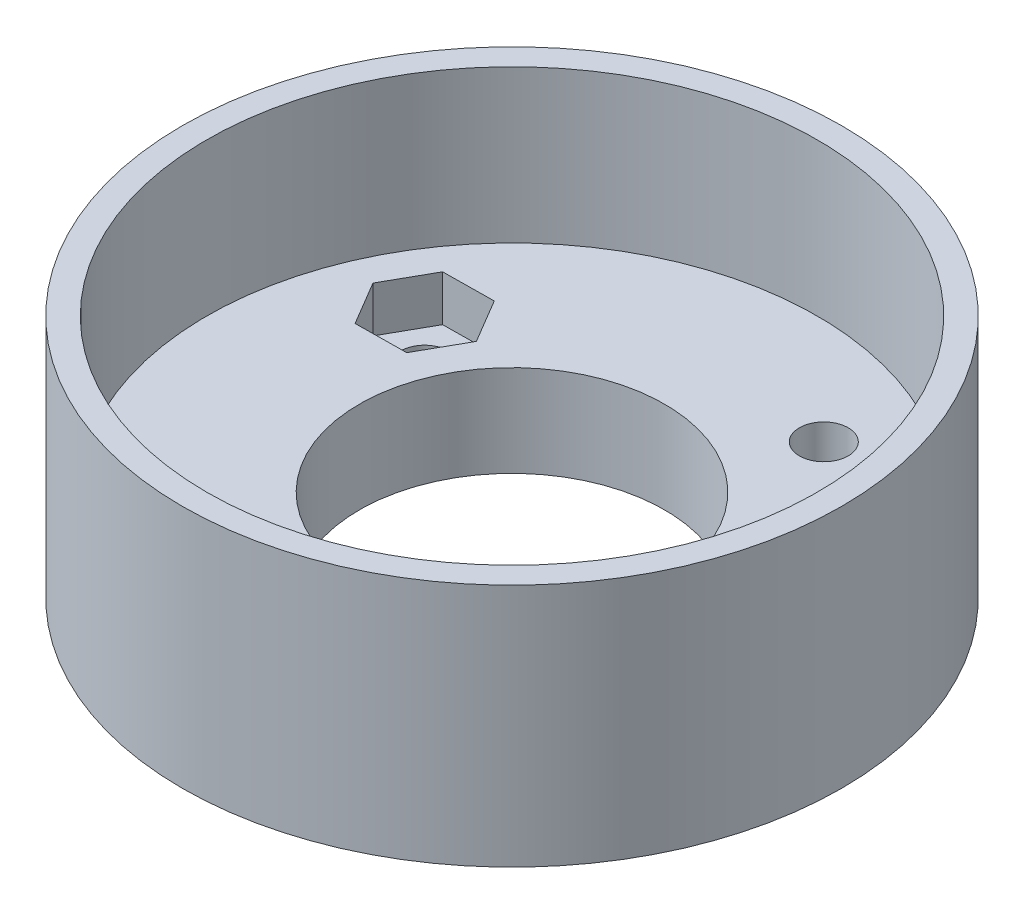
ISO-10303-21;
HEADER;
FILE_DESCRIPTION(('STEP AP214'),'2;1');
FILE_NAME('part.step','',(''),(''),'','','');
FILE_SCHEMA(('AUTOMOTIVE_DESIGN { 1 0 10303 214 1 1 1 1 }'));
ENDSEC;
DATA;
#1=APPLICATION_CONTEXT('core data for automotive mechanical design processes');
#2=APPLICATION_PROTOCOL_DEFINITION('international standard','automotive_design',2000,#1);
#3=PRODUCT_CONTEXT('',#1,'mechanical');
#4=PRODUCT('Part','Part','',(#3));
#5=PRODUCT_RELATED_PRODUCT_CATEGORY('part','',(#4));
#6=PRODUCT_DEFINITION_FORMATION('','',#4);
#7=PRODUCT_DEFINITION_CONTEXT('part definition',#1,'design');
#8=PRODUCT_DEFINITION('design','',#6,#7);
#9=PRODUCT_DEFINITION_SHAPE('','',#8);
#10=(LENGTH_UNIT() NAMED_UNIT(*) SI_UNIT(.MILLI.,.METRE.));
#11=(NAMED_UNIT(*) PLANE_ANGLE_UNIT() SI_UNIT($,.RADIAN.));
#12=(NAMED_UNIT(*) SI_UNIT($,.STERADIAN.) SOLID_ANGLE_UNIT());
#13=UNCERTAINTY_MEASURE_WITH_UNIT(LENGTH_MEASURE(1.E-05),#10,'distance_accuracy_value','');
#14=(GEOMETRIC_REPRESENTATION_CONTEXT(3) GLOBAL_UNCERTAINTY_ASSIGNED_CONTEXT((#13)) GLOBAL_UNIT_ASSIGNED_CONTEXT((#10,
#11,#12)) REPRESENTATION_CONTEXT('',''));
#15=CARTESIAN_POINT('',(0.,0.,0.));
#16=DIRECTION('',(0.,0.,1.));
#17=DIRECTION('',(1.,0.,0.));
#18=AXIS2_PLACEMENT_3D('',#15,#16,#17);
#19=CARTESIAN_POINT('',(-13.0741103754361,-6.,-7.35306996368954));
#20=DIRECTION('',(0.,1.,0.));
#21=DIRECTION('',(0.,0.,1.));
#22=AXIS2_PLACEMENT_3D('',#19,#20,#21);
#23=CYLINDRICAL_SURFACE('',#22,1.6);
#24=CARTESIAN_POINT('',(-13.0741103754361,-6.,-7.35306996368954));
#25=DIRECTION('',(0.,1.,0.));
#26=DIRECTION('',(0.,0.,-1.));
#27=AXIS2_PLACEMENT_3D('',#24,#25,#26);
#28=CIRCLE('',#27,1.6);
#29=CARTESIAN_POINT('',(-13.0741103754361,-6.,-8.95306996368954));
#30=VERTEX_POINT('',#29);
#31=EDGE_CURVE('E246',#30,#30,#28,.T.);
#32=ORIENTED_EDGE('',*,*,#31,.F.);
#33=EDGE_LOOP('',(#32));
#34=FACE_BOUND('',#33,.T.);
#35=CARTESIAN_POINT('',(-13.0741103754361,-3.,-7.35306996368954));
#36=DIRECTION('',(0.,1.,0.));
#37=DIRECTION('',(0.,0.,-1.));
#38=AXIS2_PLACEMENT_3D('',#35,#36,#37);
#39=CIRCLE('',#38,1.6);
#40=CARTESIAN_POINT('',(-13.0741103754361,-3.,-8.95306996368954));
#41=VERTEX_POINT('',#40);
#42=EDGE_CURVE('E217',#41,#41,#39,.T.);
#43=ORIENTED_EDGE('',*,*,#42,.T.);
#44=EDGE_LOOP('',(#43));
#45=FACE_BOUND('',#44,.T.);
#46=ADVANCED_FACE('F34',(#34,#45),#23,.F.);
#47=CARTESIAN_POINT('',(13.0741103754361,-6.,7.35306996368954));
#48=DIRECTION('',(0.,1.,0.));
#49=DIRECTION('',(0.,0.,1.));
#50=AXIS2_PLACEMENT_3D('',#47,#48,#49);
#51=CYLINDRICAL_SURFACE('',#50,1.6);
#52=CARTESIAN_POINT('',(13.0741103754361,-6.,7.35306996368954));
#53=DIRECTION('',(0.,1.,0.));
#54=DIRECTION('',(0.,0.,1.));
#55=AXIS2_PLACEMENT_3D('',#52,#53,#54);
#56=CIRCLE('',#55,1.6);
#57=CARTESIAN_POINT('',(13.0741103754361,-6.,8.95306996368954));
#58=VERTEX_POINT('',#57);
#59=EDGE_CURVE('E296',#58,#58,#56,.T.);
#60=ORIENTED_EDGE('',*,*,#59,.F.);
#61=EDGE_LOOP('',(#60));
#62=FACE_BOUND('',#61,.T.);
#63=CARTESIAN_POINT('',(13.0741103754361,-3.,7.35306996368954));
#64=DIRECTION('',(0.,1.,0.));
#65=DIRECTION('',(0.,0.,1.));
#66=AXIS2_PLACEMENT_3D('',#63,#64,#65);
#67=CIRCLE('',#66,1.6);
#68=CARTESIAN_POINT('',(13.0741103754361,-3.,8.95306996368954));
#69=VERTEX_POINT('',#68);
#70=EDGE_CURVE('E256',#69,#69,#67,.T.);
#71=ORIENTED_EDGE('',*,*,#70,.T.);
#72=EDGE_LOOP('',(#71));
#73=FACE_BOUND('',#72,.T.);
#74=ADVANCED_FACE('F436',(#62,#73),#51,.F.);
#75=CARTESIAN_POINT('',(0.,-6.,0.));
#76=DIRECTION('',(0.,1.,0.));
#77=DIRECTION('',(0.,0.,1.));
#78=AXIS2_PLACEMENT_3D('',#75,#76,#77);
#79=PLANE('',#78);
#80=ORIENTED_EDGE('',*,*,#31,.T.);
#81=EDGE_LOOP('',(#80));
#82=FACE_BOUND('',#81,.T.);
#83=ORIENTED_EDGE('',*,*,#59,.T.);
#84=EDGE_LOOP('',(#83));
#85=FACE_BOUND('',#84,.T.);
#86=DIRECTION('',(0.860333371471835,0.,-0.509731782344309));
#87=VECTOR('',#86,1.);
#88=CARTESIAN_POINT('',(-2.34476619878382,-6.,-3.95753350877044));
#89=LINE('',#88,#87);
#90=CARTESIAN_POINT('',(7.390822392013,-6.,-9.72569163108992));
#91=VERTEX_POINT('',#90);
#92=CARTESIAN_POINT('',(10.2717618729631,-6.,-11.4325955652457));
#93=VERTEX_POINT('',#92);
#94=EDGE_CURVE('E362',#91,#93,#89,.T.);
#95=ORIENTED_EDGE('',*,*,#94,.T.);
#96=DIRECTION('',(-0.0112739868905746,0.,-0.999936446590278));
#97=VECTOR('',#96,1.);
#98=CARTESIAN_POINT('',(10.3993390445389,-6.,-0.117249463661976));
#99=LINE('',#98,#97);
#100=CARTESIAN_POINT('',(10.2340094446396,-6.,-14.7810143095919));
#101=VERTEX_POINT('',#100);
#102=EDGE_CURVE('E380',#93,#101,#99,.T.);
#103=ORIENTED_EDGE('',*,*,#102,.T.);
#104=DIRECTION('',(-0.871607358362409,0.,-0.490204664245969));
#105=VECTOR('',#104,1.);
#106=CARTESIAN_POINT('',(8.77466349000284,-6.,-15.6017717146871));
#107=LINE('',#106,#105);
#108=CARTESIAN_POINT('',(7.31531753536608,-6.,-16.4225291197823));
#109=VERTEX_POINT('',#108);
#110=EDGE_CURVE('E383',#101,#109,#107,.T.);
#111=ORIENTED_EDGE('',*,*,#110,.T.);
#112=DIRECTION('',(-0.860333371471835,0.,0.509731782344308));
#113=VECTOR('',#112,1.);
#114=CARTESIAN_POINT('',(-5.30121053638081,-6.,-8.94746706330709));
#115=LINE('',#114,#113);
#116=CARTESIAN_POINT('',(4.434378054416,-6.,-14.7156251856266));
#117=VERTEX_POINT('',#116);
#118=EDGE_CURVE('E386',#109,#117,#115,.T.);
#119=ORIENTED_EDGE('',*,*,#118,.T.);
#120=DIRECTION('',(0.0112739868905743,0.,0.999936446590278));
#121=VECTOR('',#120,1.);
#122=CARTESIAN_POINT('',(4.59970765431528,-6.,-0.0518603396966419));
#123=LINE('',#122,#121);
#124=CARTESIAN_POINT('',(4.47213048273946,-6.,-11.3672064412804));
#125=VERTEX_POINT('',#124);
#126=EDGE_CURVE('E389',#117,#125,#123,.T.);
#127=ORIENTED_EDGE('',*,*,#126,.T.);
#128=DIRECTION('',(0.871607358362409,0.,0.490204664245969));
#129=VECTOR('',#128,1.);
#130=CARTESIAN_POINT('',(5.93147643737622,-6.,-10.5464490361851));
#131=LINE('',#130,#129);
#132=EDGE_CURVE('E367',#125,#91,#131,.T.);
#133=ORIENTED_EDGE('',*,*,#132,.T.);
#134=EDGE_LOOP('',(#95,#103,#111,#119,#127,#133));
#135=FACE_BOUND('',#134,.T.);
#136=CARTESIAN_POINT('',(0.,-6.,0.));
#137=DIRECTION('',(0.,1.,0.));
#138=DIRECTION('',(0.,0.,1.));
#139=AXIS2_PLACEMENT_3D('',#136,#137,#138);
#140=CIRCLE('',#139,21.6);
#141=CARTESIAN_POINT('',(0.,-6.,21.6));
#142=VERTEX_POINT('',#141);
#143=EDGE_CURVE('E411',#142,#142,#140,.T.);
#144=ORIENTED_EDGE('',*,*,#143,.F.);
#145=EDGE_LOOP('',(#144));
#146=FACE_BOUND('',#145,.T.);
#147=CARTESIAN_POINT('',(0.,-6.,0.));
#148=DIRECTION('',(0.,1.,0.));
#149=DIRECTION('',(0.,0.,1.));
#150=AXIS2_PLACEMENT_3D('',#147,#148,#149);
#151=CIRCLE('',#150,10.);
#152=CARTESIAN_POINT('',(0.,-6.,10.));
#153=VERTEX_POINT('',#152);
#154=EDGE_CURVE('E414',#153,#153,#151,.T.);
#155=ORIENTED_EDGE('',*,*,#154,.T.);
#156=EDGE_LOOP('',(#155));
#157=FACE_BOUND('',#156,.T.);
#158=DIRECTION('',(-0.860333371471835,0.,0.509731782344309));
#159=VECTOR('',#158,1.);
#160=CARTESIAN_POINT('',(2.34476619878382,-6.,3.95753350877044));
#161=LINE('',#160,#159);
#162=CARTESIAN_POINT('',(-7.390822392013,-6.,9.72569163108992));
#163=VERTEX_POINT('',#162);
#164=CARTESIAN_POINT('',(-10.2717618729631,-6.,11.4325955652457));
#165=VERTEX_POINT('',#164);
#166=EDGE_CURVE('E311',#163,#165,#161,.T.);
#167=ORIENTED_EDGE('',*,*,#166,.T.);
#168=DIRECTION('',(0.0112739868905746,0.,0.999936446590278));
#169=VECTOR('',#168,1.);
#170=CARTESIAN_POINT('',(-10.3993390445389,-6.,0.117249463661976));
#171=LINE('',#170,#169);
#172=CARTESIAN_POINT('',(-10.2340094446396,-6.,14.7810143095919));
#173=VERTEX_POINT('',#172);
#174=EDGE_CURVE('E329',#165,#173,#171,.T.);
#175=ORIENTED_EDGE('',*,*,#174,.T.);
#176=DIRECTION('',(0.871607358362409,0.,0.490204664245969));
#177=VECTOR('',#176,1.);
#178=CARTESIAN_POINT('',(-8.77466349000284,-6.,15.6017717146871));
#179=LINE('',#178,#177);
#180=CARTESIAN_POINT('',(-7.31531753536608,-6.,16.4225291197823));
#181=VERTEX_POINT('',#180);
#182=EDGE_CURVE('E332',#173,#181,#179,.T.);
#183=ORIENTED_EDGE('',*,*,#182,.T.);
#184=DIRECTION('',(0.860333371471835,0.,-0.509731782344308));
#185=VECTOR('',#184,1.);
#186=CARTESIAN_POINT('',(5.30121053638081,-6.,8.94746706330709));
#187=LINE('',#186,#185);
#188=CARTESIAN_POINT('',(-4.434378054416,-6.,14.7156251856266));
#189=VERTEX_POINT('',#188);
#190=EDGE_CURVE('E335',#181,#189,#187,.T.);
#191=ORIENTED_EDGE('',*,*,#190,.T.);
#192=DIRECTION('',(-0.0112739868905743,0.,-0.999936446590278));
#193=VECTOR('',#192,1.);
#194=CARTESIAN_POINT('',(-4.59970765431528,-6.,0.0518603396966419));
#195=LINE('',#194,#193);
#196=CARTESIAN_POINT('',(-4.47213048273946,-6.,11.3672064412804));
#197=VERTEX_POINT('',#196);
#198=EDGE_CURVE('E338',#189,#197,#195,.T.);
#199=ORIENTED_EDGE('',*,*,#198,.T.);
#200=DIRECTION('',(-0.871607358362409,0.,-0.490204664245969));
#201=VECTOR('',#200,1.);
#202=CARTESIAN_POINT('',(-5.93147643737622,-6.,10.5464490361851));
#203=LINE('',#202,#201);
#204=EDGE_CURVE('E316',#197,#163,#203,.T.);
#205=ORIENTED_EDGE('',*,*,#204,.T.);
#206=EDGE_LOOP('',(#167,#175,#183,#191,#199,#205));
#207=FACE_BOUND('',#206,.T.);
#208=ADVANCED_FACE('F429',(#82,#85,#135,#146,#157,#207),#79,.F.);
#209=CARTESIAN_POINT('',(0.,10.,0.));
#210=DIRECTION('',(0.,-1.,0.));
#211=DIRECTION('',(0.,0.,-1.));
#212=AXIS2_PLACEMENT_3D('',#209,#210,#211);
#213=CYLINDRICAL_SURFACE('',#212,20.);
#214=CARTESIAN_POINT('',(0.,10.,0.));
#215=DIRECTION('',(0.,1.,0.));
#216=DIRECTION('',(0.,0.,1.));
#217=AXIS2_PLACEMENT_3D('',#214,#215,#216);
#218=CIRCLE('',#217,20.);
#219=CARTESIAN_POINT('',(0.,10.,20.));
#220=VERTEX_POINT('',#219);
#221=EDGE_CURVE('E43',#220,#220,#218,.T.);
#222=ORIENTED_EDGE('',*,*,#221,.T.);
#223=EDGE_LOOP('',(#222));
#224=FACE_BOUND('',#223,.T.);
#225=CARTESIAN_POINT('',(0.,0.,0.));
#226=DIRECTION('',(0.,1.,0.));
#227=DIRECTION('',(0.,0.,1.));
#228=AXIS2_PLACEMENT_3D('',#225,#226,#227);
#229=CIRCLE('',#228,20.);
#230=CARTESIAN_POINT('',(0.,0.,20.));
#231=VERTEX_POINT('',#230);
#232=EDGE_CURVE('E38',#231,#231,#229,.T.);
#233=ORIENTED_EDGE('',*,*,#232,.F.);
#234=EDGE_LOOP('',(#233));
#235=FACE_BOUND('',#234,.T.);
#236=ADVANCED_FACE('F36',(#224,#235),#213,.F.);
#237=CARTESIAN_POINT('',(0.,10.,0.));
#238=DIRECTION('',(0.,-1.,0.));
#239=DIRECTION('',(0.,0.,-1.));
#240=AXIS2_PLACEMENT_3D('',#237,#238,#239);
#241=CYLINDRICAL_SURFACE('',#240,21.6);
#242=CARTESIAN_POINT('',(0.,10.,0.));
#243=DIRECTION('',(0.,1.,0.));
#244=DIRECTION('',(0.,0.,1.));
#245=AXIS2_PLACEMENT_3D('',#242,#243,#244);
#246=CIRCLE('',#245,21.6);
#247=CARTESIAN_POINT('',(0.,10.,21.6));
#248=VERTEX_POINT('',#247);
#249=EDGE_CURVE('E11',#248,#248,#246,.T.);
#250=ORIENTED_EDGE('',*,*,#249,.F.);
#251=EDGE_LOOP('',(#250));
#252=FACE_BOUND('',#251,.T.);
#253=ORIENTED_EDGE('',*,*,#143,.T.);
#254=EDGE_LOOP('',(#253));
#255=FACE_BOUND('',#254,.T.);
#256=ADVANCED_FACE('F428',(#252,#255),#241,.T.);
#257=CARTESIAN_POINT('',(0.,10.,0.));
#258=DIRECTION('',(0.,1.,0.));
#259=DIRECTION('',(0.,0.,1.));
#260=AXIS2_PLACEMENT_3D('',#257,#258,#259);
#261=PLANE('',#260);
#262=ORIENTED_EDGE('',*,*,#221,.F.);
#263=EDGE_LOOP('',(#262));
#264=FACE_BOUND('',#263,.T.);
#265=ORIENTED_EDGE('',*,*,#249,.T.);
#266=EDGE_LOOP('',(#265));
#267=FACE_BOUND('',#266,.T.);
#268=ADVANCED_FACE('F434',(#264,#267),#261,.T.);
#269=CARTESIAN_POINT('',(0.,0.,0.));
#270=DIRECTION('',(0.,1.,0.));
#271=DIRECTION('',(0.,0.,1.));
#272=AXIS2_PLACEMENT_3D('',#269,#270,#271);
#273=PLANE('',#272);
#274=DIRECTION('',(0.999936446590278,0.,-0.0112739868905736));
#275=VECTOR('',#274,1.);
#276=CARTESIAN_POINT('',(-0.0518603396966383,0.,-4.59970765431527));
#277=LINE('',#276,#275);
#278=CARTESIAN_POINT('',(-14.7156251856266,0.,-4.434378054416));
#279=VERTEX_POINT('',#278);
#280=CARTESIAN_POINT('',(-11.3672064412804,0.,-4.47213048273946));
#281=VERTEX_POINT('',#280);
#282=EDGE_CURVE('E50',#279,#281,#277,.T.);
#283=ORIENTED_EDGE('',*,*,#282,.F.);
#284=DIRECTION('',(0.509731782344309,0.,0.860333371471835));
#285=VECTOR('',#284,1.);
#286=CARTESIAN_POINT('',(-8.94746706330708,0.,5.30121053638081));
#287=LINE('',#286,#285);
#288=CARTESIAN_POINT('',(-16.4225291197823,0.,-7.31531753536608));
#289=VERTEX_POINT('',#288);
#290=EDGE_CURVE('E220',#289,#279,#287,.T.);
#291=ORIENTED_EDGE('',*,*,#290,.F.);
#292=DIRECTION('',(-0.49020466424597,0.,0.871607358362409));
#293=VECTOR('',#292,1.);
#294=CARTESIAN_POINT('',(-15.6017717146871,0.,-8.77466349000285));
#295=LINE('',#294,#293);
#296=CARTESIAN_POINT('',(-14.7810143095919,0.,-10.2340094446396));
#297=VERTEX_POINT('',#296);
#298=EDGE_CURVE('E239',#297,#289,#295,.T.);
#299=ORIENTED_EDGE('',*,*,#298,.F.);
#300=DIRECTION('',(-0.999936446590278,0.,0.0112739868905735));
#301=VECTOR('',#300,1.);
#302=CARTESIAN_POINT('',(-0.117249463661965,0.,-10.3993390445389));
#303=LINE('',#302,#301);
#304=CARTESIAN_POINT('',(-11.4325955652457,0.,-10.2717618729631));
#305=VERTEX_POINT('',#304);
#306=EDGE_CURVE('E236',#305,#297,#303,.T.);
#307=ORIENTED_EDGE('',*,*,#306,.F.);
#308=DIRECTION('',(-0.509731782344309,0.,-0.860333371471835));
#309=VECTOR('',#308,1.);
#310=CARTESIAN_POINT('',(-3.95753350877044,0.,2.34476619878382));
#311=LINE('',#310,#309);
#312=CARTESIAN_POINT('',(-9.72569163108992,0.,-7.390822392013));
#313=VERTEX_POINT('',#312);
#314=EDGE_CURVE('E233',#313,#305,#311,.T.);
#315=ORIENTED_EDGE('',*,*,#314,.F.);
#316=DIRECTION('',(0.490204664245969,0.,-0.871607358362409));
#317=VECTOR('',#316,1.);
#318=CARTESIAN_POINT('',(-10.5464490361851,0.,-5.93147643737623));
#319=LINE('',#318,#317);
#320=EDGE_CURVE('E231',#281,#313,#319,.T.);
#321=ORIENTED_EDGE('',*,*,#320,.F.);
#322=EDGE_LOOP('',(#283,#291,#299,#307,#315,#321));
#323=FACE_BOUND('',#322,.T.);
#324=DIRECTION('',(-0.999936446590278,0.,0.0112739868905736));
#325=VECTOR('',#324,1.);
#326=CARTESIAN_POINT('',(0.0518603396966383,0.,4.59970765431527));
#327=LINE('',#326,#325);
#328=CARTESIAN_POINT('',(14.7156251856266,0.,4.434378054416));
#329=VERTEX_POINT('',#328);
#330=CARTESIAN_POINT('',(11.3672064412804,0.,4.47213048273946));
#331=VERTEX_POINT('',#330);
#332=EDGE_CURVE('E58',#329,#331,#327,.T.);
#333=ORIENTED_EDGE('',*,*,#332,.F.);
#334=DIRECTION('',(-0.509731782344309,0.,-0.860333371471835));
#335=VECTOR('',#334,1.);
#336=CARTESIAN_POINT('',(8.94746706330708,0.,-5.30121053638081));
#337=LINE('',#336,#335);
#338=CARTESIAN_POINT('',(16.4225291197823,0.,7.31531753536608));
#339=VERTEX_POINT('',#338);
#340=EDGE_CURVE('E260',#339,#329,#337,.T.);
#341=ORIENTED_EDGE('',*,*,#340,.F.);
#342=DIRECTION('',(0.49020466424597,0.,-0.871607358362409));
#343=VECTOR('',#342,1.);
#344=CARTESIAN_POINT('',(15.6017717146871,0.,8.77466349000285));
#345=LINE('',#344,#343);
#346=CARTESIAN_POINT('',(14.7810143095919,0.,10.2340094446396));
#347=VERTEX_POINT('',#346);
#348=EDGE_CURVE('E289',#347,#339,#345,.T.);
#349=ORIENTED_EDGE('',*,*,#348,.F.);
#350=DIRECTION('',(0.999936446590278,0.,-0.0112739868905735));
#351=VECTOR('',#350,1.);
#352=CARTESIAN_POINT('',(0.117249463661965,0.,10.3993390445389));
#353=LINE('',#352,#351);
#354=CARTESIAN_POINT('',(11.4325955652457,0.,10.2717618729631));
#355=VERTEX_POINT('',#354);
#356=EDGE_CURVE('E286',#355,#347,#353,.T.);
#357=ORIENTED_EDGE('',*,*,#356,.F.);
#358=DIRECTION('',(0.509731782344309,0.,0.860333371471835));
#359=VECTOR('',#358,1.);
#360=CARTESIAN_POINT('',(3.95753350877044,0.,-2.34476619878382));
#361=LINE('',#360,#359);
#362=CARTESIAN_POINT('',(9.72569163108992,0.,7.390822392013));
#363=VERTEX_POINT('',#362);
#364=EDGE_CURVE('E283',#363,#355,#361,.T.);
#365=ORIENTED_EDGE('',*,*,#364,.F.);
#366=DIRECTION('',(-0.490204664245969,0.,0.871607358362409));
#367=VECTOR('',#366,1.);
#368=CARTESIAN_POINT('',(10.5464490361851,0.,5.93147643737623));
#369=LINE('',#368,#367);
#370=EDGE_CURVE('E280',#331,#363,#369,.T.);
#371=ORIENTED_EDGE('',*,*,#370,.F.);
#372=EDGE_LOOP('',(#333,#341,#349,#357,#365,#371));
#373=FACE_BOUND('',#372,.T.);
#374=CARTESIAN_POINT('',(-7.35306996368954,0.,13.0741103754361));
#375=DIRECTION('',(0.,1.,0.));
#376=DIRECTION('',(0.,0.,-1.));
#377=AXIS2_PLACEMENT_3D('',#374,#375,#376);
#378=CIRCLE('',#377,1.6);
#379=CARTESIAN_POINT('',(-7.35306996368954,0.,11.4741103754361));
#380=VERTEX_POINT('',#379);
#381=EDGE_CURVE('E356',#380,#380,#378,.T.);
#382=ORIENTED_EDGE('',*,*,#381,.F.);
#383=EDGE_LOOP('',(#382));
#384=FACE_BOUND('',#383,.T.);
#385=CARTESIAN_POINT('',(7.35306996368954,0.,-13.0741103754361));
#386=DIRECTION('',(0.,1.,0.));
#387=DIRECTION('',(0.,0.,1.));
#388=AXIS2_PLACEMENT_3D('',#385,#386,#387);
#389=CIRCLE('',#388,1.6);
#390=CARTESIAN_POINT('',(7.35306996368954,0.,-11.4741103754361));
#391=VERTEX_POINT('',#390);
#392=EDGE_CURVE('E407',#391,#391,#389,.T.);
#393=ORIENTED_EDGE('',*,*,#392,.F.);
#394=EDGE_LOOP('',(#393));
#395=FACE_BOUND('',#394,.T.);
#396=CARTESIAN_POINT('',(0.,0.,0.));
#397=DIRECTION('',(0.,1.,0.));
#398=DIRECTION('',(0.,0.,1.));
#399=AXIS2_PLACEMENT_3D('',#396,#397,#398);
#400=CIRCLE('',#399,10.);
#401=CARTESIAN_POINT('',(0.,0.,10.));
#402=VERTEX_POINT('',#401);
#403=EDGE_CURVE('E410',#402,#402,#400,.T.);
#404=ORIENTED_EDGE('',*,*,#403,.F.);
#405=EDGE_LOOP('',(#404));
#406=FACE_BOUND('',#405,.T.);
#407=ORIENTED_EDGE('',*,*,#232,.T.);
#408=EDGE_LOOP('',(#407));
#409=FACE_BOUND('',#408,.T.);
#410=ADVANCED_FACE('F425',(#323,#373,#384,#395,#406,#409),#273,.T.);
#411=CARTESIAN_POINT('',(0.,-6.,0.));
#412=DIRECTION('',(0.,1.,0.));
#413=DIRECTION('',(0.,0.,1.));
#414=AXIS2_PLACEMENT_3D('',#411,#412,#413);
#415=CYLINDRICAL_SURFACE('',#414,10.);
#416=ORIENTED_EDGE('',*,*,#154,.F.);
#417=EDGE_LOOP('',(#416));
#418=FACE_BOUND('',#417,.T.);
#419=ORIENTED_EDGE('',*,*,#403,.T.);
#420=EDGE_LOOP('',(#419));
#421=FACE_BOUND('',#420,.T.);
#422=ADVANCED_FACE('F549',(#418,#421),#415,.F.);
#423=CARTESIAN_POINT('',(7.35306996368954,-6.,-13.0741103754361));
#424=DIRECTION('',(0.,1.,0.));
#425=DIRECTION('',(0.,0.,1.));
#426=AXIS2_PLACEMENT_3D('',#423,#424,#425);
#427=CYLINDRICAL_SURFACE('',#426,1.6);
#428=CARTESIAN_POINT('',(7.35306996368954,-2.8,-13.0741103754361));
#429=DIRECTION('',(0.,1.,0.));
#430=DIRECTION('',(0.,0.,1.));
#431=AXIS2_PLACEMENT_3D('',#428,#429,#430);
#432=CIRCLE('',#431,1.6);
#433=CARTESIAN_POINT('',(7.35306996368954,-2.8,-11.4741103754361));
#434=VERTEX_POINT('',#433);
#435=EDGE_CURVE('E359',#434,#434,#432,.T.);
#436=ORIENTED_EDGE('',*,*,#435,.F.);
#437=EDGE_LOOP('',(#436));
#438=FACE_BOUND('',#437,.T.);
#439=ORIENTED_EDGE('',*,*,#392,.T.);
#440=EDGE_LOOP('',(#439));
#441=FACE_BOUND('',#440,.T.);
#442=ADVANCED_FACE('F524',(#438,#441),#427,.F.);
#443=CARTESIAN_POINT('',(0.,-3.,0.));
#444=DIRECTION('',(0.,1.,0.));
#445=DIRECTION('',(0.,0.,1.));
#446=AXIS2_PLACEMENT_3D('',#443,#444,#445);
#447=PLANE('',#446);
#448=DIRECTION('',(0.860333371471835,0.,-0.509731782344309));
#449=VECTOR('',#448,1.);
#450=CARTESIAN_POINT('',(-2.34476619878382,-3.,-3.95753350877044));
#451=LINE('',#450,#449);
#452=CARTESIAN_POINT('',(7.390822392013,-3.,-9.72569163108992));
#453=VERTEX_POINT('',#452);
#454=CARTESIAN_POINT('',(10.2717618729631,-3.,-11.4325955652457));
#455=VERTEX_POINT('',#454);
#456=EDGE_CURVE('E363',#453,#455,#451,.T.);
#457=ORIENTED_EDGE('',*,*,#456,.F.);
#458=DIRECTION('',(0.871607358362409,0.,0.490204664245969));
#459=VECTOR('',#458,1.);
#460=CARTESIAN_POINT('',(5.93147643737622,-3.,-10.5464490361851));
#461=LINE('',#460,#459);
#462=CARTESIAN_POINT('',(4.47213048273946,-3.,-11.3672064412804));
#463=VERTEX_POINT('',#462);
#464=EDGE_CURVE('E375',#463,#453,#461,.T.);
#465=ORIENTED_EDGE('',*,*,#464,.F.);
#466=DIRECTION('',(0.0112739868905743,0.,0.999936446590278));
#467=VECTOR('',#466,1.);
#468=CARTESIAN_POINT('',(4.59970765431528,-3.,-0.0518603396966419));
#469=LINE('',#468,#467);
#470=CARTESIAN_POINT('',(4.434378054416,-3.,-14.7156251856266));
#471=VERTEX_POINT('',#470);
#472=EDGE_CURVE('E373',#471,#463,#469,.T.);
#473=ORIENTED_EDGE('',*,*,#472,.F.);
#474=DIRECTION('',(-0.860333371471835,0.,0.509731782344308));
#475=VECTOR('',#474,1.);
#476=CARTESIAN_POINT('',(-5.30121053638081,-3.,-8.94746706330709));
#477=LINE('',#476,#475);
#478=CARTESIAN_POINT('',(7.31531753536608,-3.,-16.4225291197823));
#479=VERTEX_POINT('',#478);
#480=EDGE_CURVE('E371',#479,#471,#477,.T.);
#481=ORIENTED_EDGE('',*,*,#480,.F.);
#482=DIRECTION('',(-0.871607358362409,0.,-0.490204664245969));
#483=VECTOR('',#482,1.);
#484=CARTESIAN_POINT('',(8.77466349000284,-3.,-15.6017717146871));
#485=LINE('',#484,#483);
#486=CARTESIAN_POINT('',(10.2340094446396,-3.,-14.7810143095919));
#487=VERTEX_POINT('',#486);
#488=EDGE_CURVE('E369',#487,#479,#485,.T.);
#489=ORIENTED_EDGE('',*,*,#488,.F.);
#490=DIRECTION('',(-0.0112739868905746,0.,-0.999936446590278));
#491=VECTOR('',#490,1.);
#492=CARTESIAN_POINT('',(10.3993390445389,-3.,-0.117249463661976));
#493=LINE('',#492,#491);
#494=EDGE_CURVE('E366',#455,#487,#493,.T.);
#495=ORIENTED_EDGE('',*,*,#494,.F.);
#496=EDGE_LOOP('',(#457,#465,#473,#481,#489,#495));
#497=FACE_BOUND('',#496,.T.);
#498=ADVANCED_FACE('F520',(#497),#447,.F.);
#499=CARTESIAN_POINT('',(-2.34476619878382,-3.,-3.95753350877044));
#500=DIRECTION('',(-0.509731782344309,0.,-0.860333371471835));
#501=DIRECTION('',(-0.860333371471835,0.,0.509731782344309));
#502=AXIS2_PLACEMENT_3D('',#499,#500,#501);
#503=PLANE('',#502);
#504=ORIENTED_EDGE('',*,*,#94,.F.);
#505=DIRECTION('',(0.,-1.,0.));
#506=VECTOR('',#505,1.);
#507=CARTESIAN_POINT('',(7.390822392013,-3.,-9.72569163108992));
#508=LINE('',#507,#506);
#509=EDGE_CURVE('E377',#453,#91,#508,.T.);
#510=ORIENTED_EDGE('',*,*,#509,.F.);
#511=ORIENTED_EDGE('',*,*,#456,.T.);
#512=DIRECTION('',(0.,-1.,0.));
#513=VECTOR('',#512,1.);
#514=CARTESIAN_POINT('',(10.2717618729631,-3.,-11.4325955652457));
#515=LINE('',#514,#513);
#516=EDGE_CURVE('E404',#455,#93,#515,.T.);
#517=ORIENTED_EDGE('',*,*,#516,.T.);
#518=EDGE_LOOP('',(#504,#510,#511,#517));
#519=FACE_BOUND('',#518,.T.);
#520=ADVANCED_FACE('F523',(#519),#503,.T.);
#521=CARTESIAN_POINT('',(10.3993390445389,-3.,-0.117249463661976));
#522=DIRECTION('',(-0.999936446590278,0.,0.0112739868905746));
#523=DIRECTION('',(0.0112739868905746,0.,0.999936446590278));
#524=AXIS2_PLACEMENT_3D('',#521,#522,#523);
#525=PLANE('',#524);
#526=ORIENTED_EDGE('',*,*,#102,.F.);
#527=ORIENTED_EDGE('',*,*,#516,.F.);
#528=ORIENTED_EDGE('',*,*,#494,.T.);
#529=DIRECTION('',(0.,-1.,0.));
#530=VECTOR('',#529,1.);
#531=CARTESIAN_POINT('',(10.2340094446396,-3.,-14.7810143095919));
#532=LINE('',#531,#530);
#533=EDGE_CURVE('E402',#487,#101,#532,.T.);
#534=ORIENTED_EDGE('',*,*,#533,.T.);
#535=EDGE_LOOP('',(#526,#527,#528,#534));
#536=FACE_BOUND('',#535,.T.);
#537=ADVANCED_FACE('F540',(#536),#525,.T.);
#538=CARTESIAN_POINT('',(8.77466349000284,-3.,-15.6017717146871));
#539=DIRECTION('',(-0.490204664245968,0.,0.871607358362409));
#540=DIRECTION('',(0.871607358362409,0.,0.490204664245969));
#541=AXIS2_PLACEMENT_3D('',#538,#539,#540);
#542=PLANE('',#541);
#543=ORIENTED_EDGE('',*,*,#110,.F.);
#544=ORIENTED_EDGE('',*,*,#533,.F.);
#545=ORIENTED_EDGE('',*,*,#488,.T.);
#546=DIRECTION('',(0.,-1.,0.));
#547=VECTOR('',#546,1.);
#548=CARTESIAN_POINT('',(7.31531753536608,-3.,-16.4225291197823));
#549=LINE('',#548,#547);
#550=EDGE_CURVE('E400',#479,#109,#549,.T.);
#551=ORIENTED_EDGE('',*,*,#550,.T.);
#552=EDGE_LOOP('',(#543,#544,#545,#551));
#553=FACE_BOUND('',#552,.T.);
#554=ADVANCED_FACE('F536',(#553),#542,.T.);
#555=CARTESIAN_POINT('',(-5.30121053638081,-3.,-8.94746706330709));
#556=DIRECTION('',(0.509731782344308,0.,0.860333371471835));
#557=DIRECTION('',(0.860333371471835,0.,-0.509731782344308));
#558=AXIS2_PLACEMENT_3D('',#555,#556,#557);
#559=PLANE('',#558);
#560=ORIENTED_EDGE('',*,*,#118,.F.);
#561=ORIENTED_EDGE('',*,*,#550,.F.);
#562=ORIENTED_EDGE('',*,*,#480,.T.);
#563=DIRECTION('',(0.,-1.,0.));
#564=VECTOR('',#563,1.);
#565=CARTESIAN_POINT('',(4.434378054416,-3.,-14.7156251856266));
#566=LINE('',#565,#564);
#567=EDGE_CURVE('E398',#471,#117,#566,.T.);
#568=ORIENTED_EDGE('',*,*,#567,.T.);
#569=EDGE_LOOP('',(#560,#561,#562,#568));
#570=FACE_BOUND('',#569,.T.);
#571=ADVANCED_FACE('F532',(#570),#559,.T.);
#572=CARTESIAN_POINT('',(4.59970765431528,-3.,-0.0518603396966419));
#573=DIRECTION('',(0.999936446590278,0.,-0.0112739868905743));
#574=DIRECTION('',(-0.0112739868905743,0.,-0.999936446590278));
#575=AXIS2_PLACEMENT_3D('',#572,#573,#574);
#576=PLANE('',#575);
#577=ORIENTED_EDGE('',*,*,#126,.F.);
#578=ORIENTED_EDGE('',*,*,#567,.F.);
#579=ORIENTED_EDGE('',*,*,#472,.T.);
#580=DIRECTION('',(0.,-1.,0.));
#581=VECTOR('',#580,1.);
#582=CARTESIAN_POINT('',(4.47213048273946,-3.,-11.3672064412804));
#583=LINE('',#582,#581);
#584=EDGE_CURVE('E396',#463,#125,#583,.T.);
#585=ORIENTED_EDGE('',*,*,#584,.T.);
#586=EDGE_LOOP('',(#577,#578,#579,#585));
#587=FACE_BOUND('',#586,.T.);
#588=ADVANCED_FACE('F528',(#587),#576,.T.);
#589=CARTESIAN_POINT('',(5.93147643737622,-3.,-10.5464490361851));
#590=DIRECTION('',(0.490204664245969,0.,-0.871607358362409));
#591=DIRECTION('',(-0.871607358362409,0.,-0.490204664245969));
#592=AXIS2_PLACEMENT_3D('',#589,#590,#591);
#593=PLANE('',#592);
#594=ORIENTED_EDGE('',*,*,#132,.F.);
#595=ORIENTED_EDGE('',*,*,#584,.F.);
#596=ORIENTED_EDGE('',*,*,#464,.T.);
#597=ORIENTED_EDGE('',*,*,#509,.T.);
#598=EDGE_LOOP('',(#594,#595,#596,#597));
#599=FACE_BOUND('',#598,.T.);
#600=ADVANCED_FACE('F518',(#599),#593,.T.);
#601=CARTESIAN_POINT('',(7.35306996368954,-2.8,-13.0741103754361));
#602=DIRECTION('',(0.,1.,0.));
#603=DIRECTION('',(0.,0.,1.));
#604=AXIS2_PLACEMENT_3D('',#601,#602,#603);
#605=PLANE('',#604);
#606=ORIENTED_EDGE('',*,*,#435,.T.);
#607=EDGE_LOOP('',(#606));
#608=FACE_BOUND('',#607,.T.);
#609=ADVANCED_FACE('F514',(#608),#605,.T.);
#610=CARTESIAN_POINT('',(-7.35306996368954,-6.,13.0741103754361));
#611=DIRECTION('',(0.,1.,0.));
#612=DIRECTION('',(0.,0.,1.));
#613=AXIS2_PLACEMENT_3D('',#610,#611,#612);
#614=CYLINDRICAL_SURFACE('',#613,1.6);
#615=CARTESIAN_POINT('',(-7.35306996368954,-2.8,13.0741103754361));
#616=DIRECTION('',(0.,1.,0.));
#617=DIRECTION('',(0.,0.,1.));
#618=AXIS2_PLACEMENT_3D('',#615,#616,#617);
#619=CIRCLE('',#618,1.6);
#620=CARTESIAN_POINT('',(-7.35306996368954,-2.8,14.6741103754361));
#621=VERTEX_POINT('',#620);
#622=EDGE_CURVE('E308',#621,#621,#619,.T.);
#623=ORIENTED_EDGE('',*,*,#622,.F.);
#624=EDGE_LOOP('',(#623));
#625=FACE_BOUND('',#624,.T.);
#626=ORIENTED_EDGE('',*,*,#381,.T.);
#627=EDGE_LOOP('',(#626));
#628=FACE_BOUND('',#627,.T.);
#629=ADVANCED_FACE('F488',(#625,#628),#614,.F.);
#630=CARTESIAN_POINT('',(0.,-3.,0.));
#631=DIRECTION('',(0.,1.,0.));
#632=DIRECTION('',(0.,0.,1.));
#633=AXIS2_PLACEMENT_3D('',#630,#631,#632);
#634=PLANE('',#633);
#635=DIRECTION('',(-0.860333371471835,0.,0.509731782344309));
#636=VECTOR('',#635,1.);
#637=CARTESIAN_POINT('',(2.34476619878382,-3.,3.95753350877044));
#638=LINE('',#637,#636);
#639=CARTESIAN_POINT('',(-7.390822392013,-3.,9.72569163108992));
#640=VERTEX_POINT('',#639);
#641=CARTESIAN_POINT('',(-10.2717618729631,-3.,11.4325955652457));
#642=VERTEX_POINT('',#641);
#643=EDGE_CURVE('E312',#640,#642,#638,.T.);
#644=ORIENTED_EDGE('',*,*,#643,.F.);
#645=DIRECTION('',(-0.871607358362409,0.,-0.490204664245969));
#646=VECTOR('',#645,1.);
#647=CARTESIAN_POINT('',(-5.93147643737622,-3.,10.5464490361851));
#648=LINE('',#647,#646);
#649=CARTESIAN_POINT('',(-4.47213048273946,-3.,11.3672064412804));
#650=VERTEX_POINT('',#649);
#651=EDGE_CURVE('E324',#650,#640,#648,.T.);
#652=ORIENTED_EDGE('',*,*,#651,.F.);
#653=DIRECTION('',(-0.0112739868905743,0.,-0.999936446590278));
#654=VECTOR('',#653,1.);
#655=CARTESIAN_POINT('',(-4.59970765431528,-3.,0.0518603396966419));
#656=LINE('',#655,#654);
#657=CARTESIAN_POINT('',(-4.434378054416,-3.,14.7156251856266));
#658=VERTEX_POINT('',#657);
#659=EDGE_CURVE('E322',#658,#650,#656,.T.);
#660=ORIENTED_EDGE('',*,*,#659,.F.);
#661=DIRECTION('',(0.860333371471835,0.,-0.509731782344308));
#662=VECTOR('',#661,1.);
#663=CARTESIAN_POINT('',(5.30121053638081,-3.,8.94746706330709));
#664=LINE('',#663,#662);
#665=CARTESIAN_POINT('',(-7.31531753536608,-3.,16.4225291197823));
#666=VERTEX_POINT('',#665);
#667=EDGE_CURVE('E320',#666,#658,#664,.T.);
#668=ORIENTED_EDGE('',*,*,#667,.F.);
#669=DIRECTION('',(0.871607358362409,0.,0.490204664245969));
#670=VECTOR('',#669,1.);
#671=CARTESIAN_POINT('',(-8.77466349000284,-3.,15.6017717146871));
#672=LINE('',#671,#670);
#673=CARTESIAN_POINT('',(-10.2340094446396,-3.,14.7810143095919));
#674=VERTEX_POINT('',#673);
#675=EDGE_CURVE('E318',#674,#666,#672,.T.);
#676=ORIENTED_EDGE('',*,*,#675,.F.);
#677=DIRECTION('',(0.0112739868905746,0.,0.999936446590278));
#678=VECTOR('',#677,1.);
#679=CARTESIAN_POINT('',(-10.3993390445389,-3.,0.117249463661976));
#680=LINE('',#679,#678);
#681=EDGE_CURVE('E315',#642,#674,#680,.T.);
#682=ORIENTED_EDGE('',*,*,#681,.F.);
#683=EDGE_LOOP('',(#644,#652,#660,#668,#676,#682));
#684=FACE_BOUND('',#683,.T.);
#685=ADVANCED_FACE('F484',(#684),#634,.F.);
#686=CARTESIAN_POINT('',(2.34476619878382,-3.,3.95753350877044));
#687=DIRECTION('',(0.509731782344309,0.,0.860333371471835));
#688=DIRECTION('',(0.860333371471835,0.,-0.509731782344309));
#689=AXIS2_PLACEMENT_3D('',#686,#687,#688);
#690=PLANE('',#689);
#691=ORIENTED_EDGE('',*,*,#166,.F.);
#692=DIRECTION('',(0.,-1.,0.));
#693=VECTOR('',#692,1.);
#694=CARTESIAN_POINT('',(-7.390822392013,-3.,9.72569163108992));
#695=LINE('',#694,#693);
#696=EDGE_CURVE('E326',#640,#163,#695,.T.);
#697=ORIENTED_EDGE('',*,*,#696,.F.);
#698=ORIENTED_EDGE('',*,*,#643,.T.);
#699=DIRECTION('',(0.,-1.,0.));
#700=VECTOR('',#699,1.);
#701=CARTESIAN_POINT('',(-10.2717618729631,-3.,11.4325955652457));
#702=LINE('',#701,#700);
#703=EDGE_CURVE('E353',#642,#165,#702,.T.);
#704=ORIENTED_EDGE('',*,*,#703,.T.);
#705=EDGE_LOOP('',(#691,#697,#698,#704));
#706=FACE_BOUND('',#705,.T.);
#707=ADVANCED_FACE('F487',(#706),#690,.T.);
#708=CARTESIAN_POINT('',(-10.3993390445389,-3.,0.117249463661976));
#709=DIRECTION('',(0.999936446590278,0.,-0.0112739868905746));
#710=DIRECTION('',(-0.0112739868905746,0.,-0.999936446590278));
#711=AXIS2_PLACEMENT_3D('',#708,#709,#710);
#712=PLANE('',#711);
#713=ORIENTED_EDGE('',*,*,#174,.F.);
#714=ORIENTED_EDGE('',*,*,#703,.F.);
#715=ORIENTED_EDGE('',*,*,#681,.T.);
#716=DIRECTION('',(0.,-1.,0.));
#717=VECTOR('',#716,1.);
#718=CARTESIAN_POINT('',(-10.2340094446396,-3.,14.7810143095919));
#719=LINE('',#718,#717);
#720=EDGE_CURVE('E351',#674,#173,#719,.T.);
#721=ORIENTED_EDGE('',*,*,#720,.T.);
#722=EDGE_LOOP('',(#713,#714,#715,#721));
#723=FACE_BOUND('',#722,.T.);
#724=ADVANCED_FACE('F504',(#723),#712,.T.);
#725=CARTESIAN_POINT('',(-8.77466349000284,-3.,15.6017717146871));
#726=DIRECTION('',(0.490204664245968,0.,-0.871607358362409));
#727=DIRECTION('',(-0.871607358362409,0.,-0.490204664245969));
#728=AXIS2_PLACEMENT_3D('',#725,#726,#727);
#729=PLANE('',#728);
#730=ORIENTED_EDGE('',*,*,#182,.F.);
#731=ORIENTED_EDGE('',*,*,#720,.F.);
#732=ORIENTED_EDGE('',*,*,#675,.T.);
#733=DIRECTION('',(0.,-1.,0.));
#734=VECTOR('',#733,1.);
#735=CARTESIAN_POINT('',(-7.31531753536608,-3.,16.4225291197823));
#736=LINE('',#735,#734);
#737=EDGE_CURVE('E349',#666,#181,#736,.T.);
#738=ORIENTED_EDGE('',*,*,#737,.T.);
#739=EDGE_LOOP('',(#730,#731,#732,#738));
#740=FACE_BOUND('',#739,.T.);
#741=ADVANCED_FACE('F500',(#740),#729,.T.);
#742=CARTESIAN_POINT('',(5.30121053638081,-3.,8.94746706330709));
#743=DIRECTION('',(-0.509731782344308,0.,-0.860333371471835));
#744=DIRECTION('',(-0.860333371471835,0.,0.509731782344308));
#745=AXIS2_PLACEMENT_3D('',#742,#743,#744);
#746=PLANE('',#745);
#747=ORIENTED_EDGE('',*,*,#190,.F.);
#748=ORIENTED_EDGE('',*,*,#737,.F.);
#749=ORIENTED_EDGE('',*,*,#667,.T.);
#750=DIRECTION('',(0.,-1.,0.));
#751=VECTOR('',#750,1.);
#752=CARTESIAN_POINT('',(-4.434378054416,-3.,14.7156251856266));
#753=LINE('',#752,#751);
#754=EDGE_CURVE('E347',#658,#189,#753,.T.);
#755=ORIENTED_EDGE('',*,*,#754,.T.);
#756=EDGE_LOOP('',(#747,#748,#749,#755));
#757=FACE_BOUND('',#756,.T.);
#758=ADVANCED_FACE('F496',(#757),#746,.T.);
#759=CARTESIAN_POINT('',(-4.59970765431528,-3.,0.0518603396966419));
#760=DIRECTION('',(-0.999936446590278,0.,0.0112739868905743));
#761=DIRECTION('',(0.0112739868905743,0.,0.999936446590278));
#762=AXIS2_PLACEMENT_3D('',#759,#760,#761);
#763=PLANE('',#762);
#764=ORIENTED_EDGE('',*,*,#198,.F.);
#765=ORIENTED_EDGE('',*,*,#754,.F.);
#766=ORIENTED_EDGE('',*,*,#659,.T.);
#767=DIRECTION('',(0.,-1.,0.));
#768=VECTOR('',#767,1.);
#769=CARTESIAN_POINT('',(-4.47213048273946,-3.,11.3672064412804));
#770=LINE('',#769,#768);
#771=EDGE_CURVE('E345',#650,#197,#770,.T.);
#772=ORIENTED_EDGE('',*,*,#771,.T.);
#773=EDGE_LOOP('',(#764,#765,#766,#772));
#774=FACE_BOUND('',#773,.T.);
#775=ADVANCED_FACE('F492',(#774),#763,.T.);
#776=CARTESIAN_POINT('',(-5.93147643737622,-3.,10.5464490361851));
#777=DIRECTION('',(-0.490204664245969,0.,0.871607358362409));
#778=DIRECTION('',(0.871607358362409,0.,0.490204664245969));
#779=AXIS2_PLACEMENT_3D('',#776,#777,#778);
#780=PLANE('',#779);
#781=ORIENTED_EDGE('',*,*,#204,.F.);
#782=ORIENTED_EDGE('',*,*,#771,.F.);
#783=ORIENTED_EDGE('',*,*,#651,.T.);
#784=ORIENTED_EDGE('',*,*,#696,.T.);
#785=EDGE_LOOP('',(#781,#782,#783,#784));
#786=FACE_BOUND('',#785,.T.);
#787=ADVANCED_FACE('F482',(#786),#780,.T.);
#788=CARTESIAN_POINT('',(-7.35306996368954,-2.8,13.0741103754361));
#789=DIRECTION('',(0.,1.,0.));
#790=DIRECTION('',(0.,0.,1.));
#791=AXIS2_PLACEMENT_3D('',#788,#789,#790);
#792=PLANE('',#791);
#793=ORIENTED_EDGE('',*,*,#622,.T.);
#794=EDGE_LOOP('',(#793));
#795=FACE_BOUND('',#794,.T.);
#796=ADVANCED_FACE('F478',(#795),#792,.T.);
#797=CARTESIAN_POINT('',(0.0518603396966383,-3.,4.59970765431527));
#798=DIRECTION('',(-0.0112739868905736,0.,-0.999936446590278));
#799=DIRECTION('',(-0.999936446590278,0.,0.0112739868905736));
#800=AXIS2_PLACEMENT_3D('',#797,#798,#799);
#801=PLANE('',#800);
#802=ORIENTED_EDGE('',*,*,#332,.T.);
#803=DIRECTION('',(0.,1.,0.));
#804=VECTOR('',#803,1.);
#805=CARTESIAN_POINT('',(11.3672064412804,-3.,4.47213048273946));
#806=LINE('',#805,#804);
#807=CARTESIAN_POINT('',(11.3672064412804,-3.,4.47213048273946));
#808=VERTEX_POINT('',#807);
#809=EDGE_CURVE('E278',#808,#331,#806,.T.);
#810=ORIENTED_EDGE('',*,*,#809,.F.);
#811=DIRECTION('',(-0.999936446590278,0.,0.0112739868905736));
#812=VECTOR('',#811,1.);
#813=CARTESIAN_POINT('',(0.0518603396966383,-3.,4.59970765431527));
#814=LINE('',#813,#812);
#815=CARTESIAN_POINT('',(14.7156251856266,-3.,4.434378054416));
#816=VERTEX_POINT('',#815);
#817=EDGE_CURVE('E259',#816,#808,#814,.T.);
#818=ORIENTED_EDGE('',*,*,#817,.F.);
#819=DIRECTION('',(0.,1.,0.));
#820=VECTOR('',#819,1.);
#821=CARTESIAN_POINT('',(14.7156251856266,-3.,4.434378054416));
#822=LINE('',#821,#820);
#823=EDGE_CURVE('E294',#816,#329,#822,.T.);
#824=ORIENTED_EDGE('',*,*,#823,.T.);
#825=EDGE_LOOP('',(#802,#810,#818,#824));
#826=FACE_BOUND('',#825,.T.);
#827=ADVANCED_FACE('F461',(#826),#801,.F.);
#828=CARTESIAN_POINT('',(8.94746706330708,-3.,-5.30121053638081));
#829=DIRECTION('',(0.860333371471835,0.,-0.509731782344309));
#830=DIRECTION('',(-0.509731782344309,0.,-0.860333371471835));
#831=AXIS2_PLACEMENT_3D('',#828,#829,#830);
#832=PLANE('',#831);
#833=ORIENTED_EDGE('',*,*,#340,.T.);
#834=ORIENTED_EDGE('',*,*,#823,.F.);
#835=DIRECTION('',(-0.509731782344309,0.,-0.860333371471835));
#836=VECTOR('',#835,1.);
#837=CARTESIAN_POINT('',(8.94746706330708,-3.,-5.30121053638081));
#838=LINE('',#837,#836);
#839=CARTESIAN_POINT('',(16.4225291197823,-3.,7.31531753536608));
#840=VERTEX_POINT('',#839);
#841=EDGE_CURVE('E275',#840,#816,#838,.T.);
#842=ORIENTED_EDGE('',*,*,#841,.F.);
#843=DIRECTION('',(0.,1.,0.));
#844=VECTOR('',#843,1.);
#845=CARTESIAN_POINT('',(16.4225291197823,-3.,7.31531753536608));
#846=LINE('',#845,#844);
#847=EDGE_CURVE('E297',#840,#339,#846,.T.);
#848=ORIENTED_EDGE('',*,*,#847,.T.);
#849=EDGE_LOOP('',(#833,#834,#842,#848));
#850=FACE_BOUND('',#849,.T.);
#851=ADVANCED_FACE('F457',(#850),#832,.F.);
#852=CARTESIAN_POINT('',(15.6017717146871,-3.,8.77466349000285));
#853=DIRECTION('',(0.871607358362409,0.,0.49020466424597));
#854=DIRECTION('',(0.49020466424597,0.,-0.871607358362409));
#855=AXIS2_PLACEMENT_3D('',#852,#853,#854);
#856=PLANE('',#855);
#857=ORIENTED_EDGE('',*,*,#348,.T.);
#858=ORIENTED_EDGE('',*,*,#847,.F.);
#859=DIRECTION('',(0.49020466424597,0.,-0.871607358362409));
#860=VECTOR('',#859,1.);
#861=CARTESIAN_POINT('',(15.6017717146871,-3.,8.77466349000285));
#862=LINE('',#861,#860);
#863=CARTESIAN_POINT('',(14.7810143095919,-3.,10.2340094446396));
#864=VERTEX_POINT('',#863);
#865=EDGE_CURVE('E272',#864,#840,#862,.T.);
#866=ORIENTED_EDGE('',*,*,#865,.F.);
#867=DIRECTION('',(0.,1.,0.));
#868=VECTOR('',#867,1.);
#869=CARTESIAN_POINT('',(14.7810143095919,-3.,10.2340094446396));
#870=LINE('',#869,#868);
#871=EDGE_CURVE('E299',#864,#347,#870,.T.);
#872=ORIENTED_EDGE('',*,*,#871,.T.);
#873=EDGE_LOOP('',(#857,#858,#866,#872));
#874=FACE_BOUND('',#873,.T.);
#875=ADVANCED_FACE('F460',(#874),#856,.F.);
#876=CARTESIAN_POINT('',(0.117249463661965,-3.,10.3993390445389));
#877=DIRECTION('',(0.0112739868905735,0.,0.999936446590278));
#878=DIRECTION('',(0.999936446590278,0.,-0.0112739868905735));
#879=AXIS2_PLACEMENT_3D('',#876,#877,#878);
#880=PLANE('',#879);
#881=ORIENTED_EDGE('',*,*,#356,.T.);
#882=ORIENTED_EDGE('',*,*,#871,.F.);
#883=DIRECTION('',(0.999936446590278,0.,-0.0112739868905735));
#884=VECTOR('',#883,1.);
#885=CARTESIAN_POINT('',(0.117249463661965,-3.,10.3993390445389));
#886=LINE('',#885,#884);
#887=CARTESIAN_POINT('',(11.4325955652457,-3.,10.2717618729631));
#888=VERTEX_POINT('',#887);
#889=EDGE_CURVE('E269',#888,#864,#886,.T.);
#890=ORIENTED_EDGE('',*,*,#889,.F.);
#891=DIRECTION('',(0.,1.,0.));
#892=VECTOR('',#891,1.);
#893=CARTESIAN_POINT('',(11.4325955652457,-3.,10.2717618729631));
#894=LINE('',#893,#892);
#895=EDGE_CURVE('E301',#888,#355,#894,.T.);
#896=ORIENTED_EDGE('',*,*,#895,.T.);
#897=EDGE_LOOP('',(#881,#882,#890,#896));
#898=FACE_BOUND('',#897,.T.);
#899=ADVANCED_FACE('F465',(#898),#880,.F.);
#900=CARTESIAN_POINT('',(3.95753350877044,-3.,-2.34476619878382));
#901=DIRECTION('',(-0.860333371471835,0.,0.509731782344309));
#902=DIRECTION('',(0.509731782344309,0.,0.860333371471835));
#903=AXIS2_PLACEMENT_3D('',#900,#901,#902);
#904=PLANE('',#903);
#905=ORIENTED_EDGE('',*,*,#364,.T.);
#906=ORIENTED_EDGE('',*,*,#895,.F.);
#907=DIRECTION('',(0.509731782344309,0.,0.860333371471835));
#908=VECTOR('',#907,1.);
#909=CARTESIAN_POINT('',(3.95753350877044,-3.,-2.34476619878382));
#910=LINE('',#909,#908);
#911=CARTESIAN_POINT('',(9.72569163108992,-3.,7.390822392013));
#912=VERTEX_POINT('',#911);
#913=EDGE_CURVE('E266',#912,#888,#910,.T.);
#914=ORIENTED_EDGE('',*,*,#913,.F.);
#915=DIRECTION('',(0.,1.,0.));
#916=VECTOR('',#915,1.);
#917=CARTESIAN_POINT('',(9.72569163108992,-3.,7.390822392013));
#918=LINE('',#917,#916);
#919=EDGE_CURVE('E303',#912,#363,#918,.T.);
#920=ORIENTED_EDGE('',*,*,#919,.T.);
#921=EDGE_LOOP('',(#905,#906,#914,#920));
#922=FACE_BOUND('',#921,.T.);
#923=ADVANCED_FACE('F469',(#922),#904,.F.);
#924=CARTESIAN_POINT('',(10.5464490361851,-3.,5.93147643737623));
#925=DIRECTION('',(-0.871607358362409,0.,-0.490204664245969));
#926=DIRECTION('',(-0.490204664245969,0.,0.871607358362409));
#927=AXIS2_PLACEMENT_3D('',#924,#925,#926);
#928=PLANE('',#927);
#929=ORIENTED_EDGE('',*,*,#370,.T.);
#930=ORIENTED_EDGE('',*,*,#919,.F.);
#931=DIRECTION('',(-0.490204664245969,0.,0.871607358362409));
#932=VECTOR('',#931,1.);
#933=CARTESIAN_POINT('',(10.5464490361851,-3.,5.93147643737623));
#934=LINE('',#933,#932);
#935=EDGE_CURVE('E263',#808,#912,#934,.T.);
#936=ORIENTED_EDGE('',*,*,#935,.F.);
#937=ORIENTED_EDGE('',*,*,#809,.T.);
#938=EDGE_LOOP('',(#929,#930,#936,#937));
#939=FACE_BOUND('',#938,.T.);
#940=ADVANCED_FACE('F455',(#939),#928,.F.);
#941=CARTESIAN_POINT('',(0.,-3.,0.));
#942=DIRECTION('',(0.,1.,0.));
#943=DIRECTION('',(0.,0.,1.));
#944=AXIS2_PLACEMENT_3D('',#941,#942,#943);
#945=PLANE('',#944);
#946=ORIENTED_EDGE('',*,*,#70,.F.);
#947=EDGE_LOOP('',(#946));
#948=FACE_BOUND('',#947,.T.);
#949=ORIENTED_EDGE('',*,*,#817,.T.);
#950=ORIENTED_EDGE('',*,*,#935,.T.);
#951=ORIENTED_EDGE('',*,*,#913,.T.);
#952=ORIENTED_EDGE('',*,*,#889,.T.);
#953=ORIENTED_EDGE('',*,*,#865,.T.);
#954=ORIENTED_EDGE('',*,*,#841,.T.);
#955=EDGE_LOOP('',(#949,#950,#951,#952,#953,#954));
#956=FACE_BOUND('',#955,.T.);
#957=ADVANCED_FACE('F452',(#948,#956),#945,.T.);
#958=CARTESIAN_POINT('',(-0.0518603396966383,-3.,-4.59970765431527));
#959=DIRECTION('',(0.0112739868905736,0.,0.999936446590278));
#960=DIRECTION('',(0.999936446590278,0.,-0.0112739868905736));
#961=AXIS2_PLACEMENT_3D('',#958,#959,#960);
#962=PLANE('',#961);
#963=ORIENTED_EDGE('',*,*,#282,.T.);
#964=DIRECTION('',(0.,1.,0.));
#965=VECTOR('',#964,1.);
#966=CARTESIAN_POINT('',(-11.3672064412804,-3.,-4.47213048273946));
#967=LINE('',#966,#965);
#968=CARTESIAN_POINT('',(-11.3672064412804,-3.,-4.47213048273946));
#969=VERTEX_POINT('',#968);
#970=EDGE_CURVE('E194',#969,#281,#967,.T.);
#971=ORIENTED_EDGE('',*,*,#970,.F.);
#972=DIRECTION('',(0.999936446590278,0.,-0.0112739868905736));
#973=VECTOR('',#972,1.);
#974=CARTESIAN_POINT('',(-0.0518603396966383,-3.,-4.59970765431527));
#975=LINE('',#974,#973);
#976=CARTESIAN_POINT('',(-14.7156251856266,-3.,-4.434378054416));
#977=VERTEX_POINT('',#976);
#978=EDGE_CURVE('E198',#977,#969,#975,.T.);
#979=ORIENTED_EDGE('',*,*,#978,.F.);
#980=DIRECTION('',(0.,1.,0.));
#981=VECTOR('',#980,1.);
#982=CARTESIAN_POINT('',(-14.7156251856266,-3.,-4.434378054416));
#983=LINE('',#982,#981);
#984=EDGE_CURVE('E244',#977,#279,#983,.T.);
#985=ORIENTED_EDGE('',*,*,#984,.T.);
#986=EDGE_LOOP('',(#963,#971,#979,#985));
#987=FACE_BOUND('',#986,.T.);
#988=ADVANCED_FACE('F196',(#987),#962,.F.);
#989=CARTESIAN_POINT('',(-8.94746706330708,-3.,5.30121053638081));
#990=DIRECTION('',(-0.860333371471835,0.,0.509731782344309));
#991=DIRECTION('',(0.509731782344309,0.,0.860333371471835));
#992=AXIS2_PLACEMENT_3D('',#989,#990,#991);
#993=PLANE('',#992);
#994=ORIENTED_EDGE('',*,*,#290,.T.);
#995=ORIENTED_EDGE('',*,*,#984,.F.);
#996=DIRECTION('',(0.509731782344309,0.,0.860333371471835));
#997=VECTOR('',#996,1.);
#998=CARTESIAN_POINT('',(-8.94746706330708,-3.,5.30121053638081));
#999=LINE('',#998,#997);
#1000=CARTESIAN_POINT('',(-16.4225291197823,-3.,-7.31531753536608));
#1001=VERTEX_POINT('',#1000);
#1002=EDGE_CURVE('E204',#1001,#977,#999,.T.);
#1003=ORIENTED_EDGE('',*,*,#1002,.F.);
#1004=DIRECTION('',(0.,1.,0.));
#1005=VECTOR('',#1004,1.);
#1006=CARTESIAN_POINT('',(-16.4225291197823,-3.,-7.31531753536608));
#1007=LINE('',#1006,#1005);
#1008=EDGE_CURVE('E247',#1001,#289,#1007,.T.);
#1009=ORIENTED_EDGE('',*,*,#1008,.T.);
#1010=EDGE_LOOP('',(#994,#995,#1003,#1009));
#1011=FACE_BOUND('',#1010,.T.);
#1012=ADVANCED_FACE('F706',(#1011),#993,.F.);
#1013=CARTESIAN_POINT('',(-15.6017717146871,-3.,-8.77466349000285));
#1014=DIRECTION('',(-0.871607358362409,0.,-0.49020466424597));
#1015=DIRECTION('',(-0.49020466424597,0.,0.871607358362409));
#1016=AXIS2_PLACEMENT_3D('',#1013,#1014,#1015);
#1017=PLANE('',#1016);
#1018=ORIENTED_EDGE('',*,*,#298,.T.);
#1019=ORIENTED_EDGE('',*,*,#1008,.F.);
#1020=DIRECTION('',(-0.49020466424597,0.,0.871607358362409));
#1021=VECTOR('',#1020,1.);
#1022=CARTESIAN_POINT('',(-15.6017717146871,-3.,-8.77466349000285));
#1023=LINE('',#1022,#1021);
#1024=CARTESIAN_POINT('',(-14.7810143095919,-3.,-10.2340094446396));
#1025=VERTEX_POINT('',#1024);
#1026=EDGE_CURVE('E227',#1025,#1001,#1023,.T.);
#1027=ORIENTED_EDGE('',*,*,#1026,.F.);
#1028=DIRECTION('',(0.,1.,0.));
#1029=VECTOR('',#1028,1.);
#1030=CARTESIAN_POINT('',(-14.7810143095919,-3.,-10.2340094446396));
#1031=LINE('',#1030,#1029);
#1032=EDGE_CURVE('E249',#1025,#297,#1031,.T.);
#1033=ORIENTED_EDGE('',*,*,#1032,.T.);
#1034=EDGE_LOOP('',(#1018,#1019,#1027,#1033));
#1035=FACE_BOUND('',#1034,.T.);
#1036=ADVANCED_FACE('F712',(#1035),#1017,.F.);
#1037=CARTESIAN_POINT('',(-0.117249463661965,-3.,-10.3993390445389));
#1038=DIRECTION('',(-0.0112739868905735,0.,-0.999936446590278));
#1039=DIRECTION('',(-0.999936446590278,0.,0.0112739868905735));
#1040=AXIS2_PLACEMENT_3D('',#1037,#1038,#1039);
#1041=PLANE('',#1040);
#1042=ORIENTED_EDGE('',*,*,#306,.T.);
#1043=ORIENTED_EDGE('',*,*,#1032,.F.);
#1044=DIRECTION('',(-0.999936446590278,0.,0.0112739868905735));
#1045=VECTOR('',#1044,1.);
#1046=CARTESIAN_POINT('',(-0.117249463661965,-3.,-10.3993390445389));
#1047=LINE('',#1046,#1045);
#1048=CARTESIAN_POINT('',(-11.4325955652457,-3.,-10.2717618729631));
#1049=VERTEX_POINT('',#1048);
#1050=EDGE_CURVE('E224',#1049,#1025,#1047,.T.);
#1051=ORIENTED_EDGE('',*,*,#1050,.F.);
#1052=DIRECTION('',(0.,1.,0.));
#1053=VECTOR('',#1052,1.);
#1054=CARTESIAN_POINT('',(-11.4325955652457,-3.,-10.2717618729631));
#1055=LINE('',#1054,#1053);
#1056=EDGE_CURVE('E251',#1049,#305,#1055,.T.);
#1057=ORIENTED_EDGE('',*,*,#1056,.T.);
#1058=EDGE_LOOP('',(#1042,#1043,#1051,#1057));
#1059=FACE_BOUND('',#1058,.T.);
#1060=ADVANCED_FACE('F720',(#1059),#1041,.F.);
#1061=CARTESIAN_POINT('',(-3.95753350877044,-3.,2.34476619878382));
#1062=DIRECTION('',(0.860333371471835,0.,-0.509731782344309));
#1063=DIRECTION('',(-0.509731782344309,0.,-0.860333371471835));
#1064=AXIS2_PLACEMENT_3D('',#1061,#1062,#1063);
#1065=PLANE('',#1064);
#1066=ORIENTED_EDGE('',*,*,#314,.T.);
#1067=ORIENTED_EDGE('',*,*,#1056,.F.);
#1068=DIRECTION('',(-0.509731782344309,0.,-0.860333371471835));
#1069=VECTOR('',#1068,1.);
#1070=CARTESIAN_POINT('',(-3.95753350877044,-3.,2.34476619878382));
#1071=LINE('',#1070,#1069);
#1072=CARTESIAN_POINT('',(-9.72569163108992,-3.,-7.390822392013));
#1073=VERTEX_POINT('',#1072);
#1074=EDGE_CURVE('E212',#1073,#1049,#1071,.T.);
#1075=ORIENTED_EDGE('',*,*,#1074,.F.);
#1076=DIRECTION('',(0.,1.,0.));
#1077=VECTOR('',#1076,1.);
#1078=CARTESIAN_POINT('',(-9.72569163108992,-3.,-7.390822392013));
#1079=LINE('',#1078,#1077);
#1080=EDGE_CURVE('E203',#1073,#313,#1079,.T.);
#1081=ORIENTED_EDGE('',*,*,#1080,.T.);
#1082=EDGE_LOOP('',(#1066,#1067,#1075,#1081));
#1083=FACE_BOUND('',#1082,.T.);
#1084=ADVANCED_FACE('F728',(#1083),#1065,.F.);
#1085=CARTESIAN_POINT('',(-10.5464490361851,-3.,-5.93147643737623));
#1086=DIRECTION('',(0.871607358362409,0.,0.490204664245969));
#1087=DIRECTION('',(0.490204664245969,0.,-0.871607358362409));
#1088=AXIS2_PLACEMENT_3D('',#1085,#1086,#1087);
#1089=PLANE('',#1088);
#1090=ORIENTED_EDGE('',*,*,#320,.T.);
#1091=ORIENTED_EDGE('',*,*,#1080,.F.);
#1092=DIRECTION('',(0.490204664245969,0.,-0.871607358362409));
#1093=VECTOR('',#1092,1.);
#1094=CARTESIAN_POINT('',(-10.5464490361851,-3.,-5.93147643737623));
#1095=LINE('',#1094,#1093);
#1096=EDGE_CURVE('E207',#969,#1073,#1095,.T.);
#1097=ORIENTED_EDGE('',*,*,#1096,.F.);
#1098=ORIENTED_EDGE('',*,*,#970,.T.);
#1099=EDGE_LOOP('',(#1090,#1091,#1097,#1098));
#1100=FACE_BOUND('',#1099,.T.);
#1101=ADVANCED_FACE('F208',(#1100),#1089,.F.);
#1102=CARTESIAN_POINT('',(0.,-3.,0.));
#1103=DIRECTION('',(0.,1.,0.));
#1104=DIRECTION('',(0.,0.,-1.));
#1105=AXIS2_PLACEMENT_3D('',#1102,#1103,#1104);
#1106=PLANE('',#1105);
#1107=ORIENTED_EDGE('',*,*,#42,.F.);
#1108=EDGE_LOOP('',(#1107));
#1109=FACE_BOUND('',#1108,.T.);
#1110=ORIENTED_EDGE('',*,*,#978,.T.);
#1111=ORIENTED_EDGE('',*,*,#1096,.T.);
#1112=ORIENTED_EDGE('',*,*,#1074,.T.);
#1113=ORIENTED_EDGE('',*,*,#1050,.T.);
#1114=ORIENTED_EDGE('',*,*,#1026,.T.);
#1115=ORIENTED_EDGE('',*,*,#1002,.T.);
#1116=EDGE_LOOP('',(#1110,#1111,#1112,#1113,#1114,#1115));
#1117=FACE_BOUND('',#1116,.T.);
#1118=ADVANCED_FACE('F214',(#1109,#1117),#1106,.T.);
#1119=CLOSED_SHELL('',(#46,#74,#208,#236,#256,#268,#410,#422,#442,#498,#520,#537,#554,#571,#588,
#600,#609,#629,#685,#707,#724,#741,#758,#775,#787,#796,#827,#851,#875,#899,#923,#940,#957,#988,
#1012,#1036,#1060,#1084,#1101,#1118));
#1120=MANIFOLD_SOLID_BREP('B2',#1119);
#1121=ADVANCED_BREP_SHAPE_REPRESENTATION('',(#18,#1120),#14);
#1122=SHAPE_DEFINITION_REPRESENTATION(#9,#1121);
ENDSEC;
END-ISO-10303-21;
